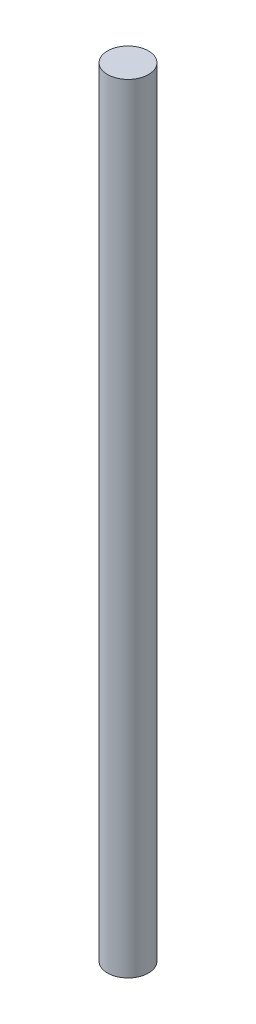
ISO-10303-21;
HEADER;
FILE_DESCRIPTION(('STEP AP214'),'2;1');
FILE_NAME('part.step','',(''),(''),'','','');
FILE_SCHEMA(('AUTOMOTIVE_DESIGN { 1 0 10303 214 1 1 1 1 }'));
ENDSEC;
DATA;
#1=APPLICATION_CONTEXT('core data for automotive mechanical design processes');
#2=APPLICATION_PROTOCOL_DEFINITION('international standard','automotive_design',2000,#1);
#3=PRODUCT_CONTEXT('',#1,'mechanical');
#4=PRODUCT('Part','Part','',(#3));
#5=PRODUCT_RELATED_PRODUCT_CATEGORY('part','',(#4));
#6=PRODUCT_DEFINITION_FORMATION('','',#4);
#7=PRODUCT_DEFINITION_CONTEXT('part definition',#1,'design');
#8=PRODUCT_DEFINITION('design','',#6,#7);
#9=PRODUCT_DEFINITION_SHAPE('','',#8);
#10=(LENGTH_UNIT() NAMED_UNIT(*) SI_UNIT(.MILLI.,.METRE.));
#11=(NAMED_UNIT(*) PLANE_ANGLE_UNIT() SI_UNIT($,.RADIAN.));
#12=(NAMED_UNIT(*) SI_UNIT($,.STERADIAN.) SOLID_ANGLE_UNIT());
#13=UNCERTAINTY_MEASURE_WITH_UNIT(LENGTH_MEASURE(1.E-05),#10,'distance_accuracy_value','');
#14=(GEOMETRIC_REPRESENTATION_CONTEXT(3) GLOBAL_UNCERTAINTY_ASSIGNED_CONTEXT((#13)) GLOBAL_UNIT_ASSIGNED_CONTEXT((#10,
#11,#12)) REPRESENTATION_CONTEXT('',''));
#15=CARTESIAN_POINT('',(0.,0.,0.));
#16=DIRECTION('',(0.,0.,1.));
#17=DIRECTION('',(1.,0.,0.));
#18=AXIS2_PLACEMENT_3D('',#15,#16,#17);
#19=CARTESIAN_POINT('',(0.,120.65,0.));
#20=DIRECTION('',(0.,-1.,0.));
#21=DIRECTION('',(0.,0.,-1.));
#22=AXIS2_PLACEMENT_3D('',#19,#20,#21);
#23=CYLINDRICAL_SURFACE('',#22,3.175);
#24=CARTESIAN_POINT('',(0.,120.65,0.));
#25=DIRECTION('',(0.,1.,0.));
#26=DIRECTION('',(0.,0.,1.));
#27=AXIS2_PLACEMENT_3D('',#24,#25,#26);
#28=CIRCLE('',#27,3.175);
#29=CARTESIAN_POINT('',(0.,120.65,-3.175));
#30=VERTEX_POINT('',#29);
#31=EDGE_CURVE('E10',#30,#30,#28,.T.);
#32=CARTESIAN_POINT('',(0.,0.,0.));
#33=DIRECTION('',(0.,1.,0.));
#34=DIRECTION('',(0.,0.,1.));
#35=AXIS2_PLACEMENT_3D('',#32,#33,#34);
#36=CIRCLE('',#35,3.175);
#37=CARTESIAN_POINT('',(0.,0.,-3.175));
#38=VERTEX_POINT('',#37);
#39=EDGE_CURVE('E44',#38,#38,#36,.T.);
#40=CARTESIAN_POINT('',(0.,120.65,-3.175));
#41=CARTESIAN_POINT('',(0.,119.393229166667,-3.175));
#42=CARTESIAN_POINT('',(0.,118.136458333333,-3.175));
#43=CARTESIAN_POINT('',(0.,115.622916666667,-3.175));
#44=CARTESIAN_POINT('',(0.,114.366145833333,-3.175));
#45=CARTESIAN_POINT('',(0.,111.852604166667,-3.175));
#46=CARTESIAN_POINT('',(0.,110.595833333333,-3.175));
#47=CARTESIAN_POINT('',(0.,108.082291666667,-3.175));
#48=CARTESIAN_POINT('',(0.,106.825520833333,-3.175));
#49=CARTESIAN_POINT('',(0.,104.311979166667,-3.175));
#50=CARTESIAN_POINT('',(0.,103.055208333333,-3.175));
#51=CARTESIAN_POINT('',(0.,100.541666666667,-3.175));
#52=CARTESIAN_POINT('',(0.,99.2848958333333,-3.175));
#53=CARTESIAN_POINT('',(0.,96.7713541666667,-3.175));
#54=CARTESIAN_POINT('',(0.,95.5145833333333,-3.175));
#55=CARTESIAN_POINT('',(0.,93.0010416666667,-3.175));
#56=CARTESIAN_POINT('',(0.,91.7442708333333,-3.175));
#57=CARTESIAN_POINT('',(0.,89.2307291666667,-3.175));
#58=CARTESIAN_POINT('',(0.,87.9739583333333,-3.175));
#59=CARTESIAN_POINT('',(0.,85.4604166666667,-3.175));
#60=CARTESIAN_POINT('',(0.,84.2036458333333,-3.175));
#61=CARTESIAN_POINT('',(0.,81.6901041666667,-3.175));
#62=CARTESIAN_POINT('',(0.,80.4333333333333,-3.175));
#63=CARTESIAN_POINT('',(0.,77.9197916666667,-3.175));
#64=CARTESIAN_POINT('',(0.,76.6630208333333,-3.175));
#65=CARTESIAN_POINT('',(0.,74.1494791666667,-3.175));
#66=CARTESIAN_POINT('',(0.,72.8927083333333,-3.175));
#67=CARTESIAN_POINT('',(0.,70.3791666666667,-3.175));
#68=CARTESIAN_POINT('',(0.,69.1223958333333,-3.175));
#69=CARTESIAN_POINT('',(0.,66.6088541666667,-3.175));
#70=CARTESIAN_POINT('',(0.,65.3520833333333,-3.175));
#71=CARTESIAN_POINT('',(0.,62.8385416666667,-3.175));
#72=CARTESIAN_POINT('',(0.,61.5817708333333,-3.175));
#73=CARTESIAN_POINT('',(0.,59.0682291666667,-3.175));
#74=CARTESIAN_POINT('',(0.,57.8114583333333,-3.175));
#75=CARTESIAN_POINT('',(0.,55.2979166666667,-3.175));
#76=CARTESIAN_POINT('',(0.,54.0411458333333,-3.175));
#77=CARTESIAN_POINT('',(0.,51.5276041666667,-3.175));
#78=CARTESIAN_POINT('',(0.,50.2708333333333,-3.175));
#79=CARTESIAN_POINT('',(0.,47.7572916666667,-3.175));
#80=CARTESIAN_POINT('',(0.,46.5005208333333,-3.175));
#81=CARTESIAN_POINT('',(0.,43.9869791666667,-3.175));
#82=CARTESIAN_POINT('',(0.,42.7302083333333,-3.175));
#83=CARTESIAN_POINT('',(0.,40.2166666666667,-3.175));
#84=CARTESIAN_POINT('',(0.,38.9598958333333,-3.175));
#85=CARTESIAN_POINT('',(0.,36.4463541666667,-3.175));
#86=CARTESIAN_POINT('',(0.,35.1895833333333,-3.175));
#87=CARTESIAN_POINT('',(0.,32.6760416666667,-3.175));
#88=CARTESIAN_POINT('',(0.,31.4192708333333,-3.175));
#89=CARTESIAN_POINT('',(0.,28.9057291666667,-3.175));
#90=CARTESIAN_POINT('',(0.,27.6489583333333,-3.175));
#91=CARTESIAN_POINT('',(0.,25.1354166666667,-3.175));
#92=CARTESIAN_POINT('',(0.,23.8786458333333,-3.175));
#93=CARTESIAN_POINT('',(0.,21.3651041666667,-3.175));
#94=CARTESIAN_POINT('',(0.,20.1083333333333,-3.175));
#95=CARTESIAN_POINT('',(0.,17.5947916666667,-3.175));
#96=CARTESIAN_POINT('',(0.,16.3380208333333,-3.175));
#97=CARTESIAN_POINT('',(0.,13.8244791666667,-3.175));
#98=CARTESIAN_POINT('',(0.,12.5677083333333,-3.175));
#99=CARTESIAN_POINT('',(0.,10.0541666666667,-3.175));
#100=CARTESIAN_POINT('',(0.,8.79739583333333,-3.175));
#101=CARTESIAN_POINT('',(0.,6.28385416666666,-3.175));
#102=CARTESIAN_POINT('',(0.,5.02708333333333,-3.175));
#103=CARTESIAN_POINT('',(0.,2.51354166666667,-3.175));
#104=CARTESIAN_POINT('',(0.,1.25677083333333,-3.175));
#105=CARTESIAN_POINT('',(0.,0.,-3.175));
#106=B_SPLINE_CURVE_WITH_KNOTS('',3,(#40,#41,#42,#43,#44,#45,#46,#47,#48,#49,#50,#51,#52,#53,
#54,#55,#56,#57,#58,#59,#60,#61,#62,#63,#64,#65,#66,#67,#68,#69,#70,#71,#72,#73,#74,#75,#76,#77,
#78,#79,#80,#81,#82,#83,#84,#85,#86,#87,#88,#89,#90,#91,#92,#93,#94,#95,#96,#97,#98,#99,#100,
#101,#102,#103,#104,#105),.UNSPECIFIED.,.F.,.F.,(4,2,2,2,2,2,2,2,2,2,2,2,2,2,2,2,2,2,2,2,2,2,2,
2,2,2,2,2,2,2,2,2,4),(0.,3.7703125,7.540625,11.3109375,15.08125,18.8515625,22.621875,26.3921875,
30.1625,33.9328125,37.703125,41.4734375,45.24375,49.0140625,52.784375,56.5546875,60.325,
64.0953125,67.865625,71.6359375,75.40625,79.1765625,82.946875,86.7171875,90.4875,94.2578125,
98.028125,101.7984375,105.56875,109.3390625,113.109375,116.8796875,120.65),.UNSPECIFIED.);
#107=EDGE_CURVE('BSEAM41',#30,#38,#106,.T.);
#108=ORIENTED_EDGE('',*,*,#31,.F.);
#109=ORIENTED_EDGE('',*,*,#39,.T.);
#110=ORIENTED_EDGE('',*,*,#107,.T.);
#111=ORIENTED_EDGE('',*,*,#107,.F.);
#112=EDGE_LOOP('',(#108,#110,#109,#111));
#113=FACE_BOUND('',#112,.T.);
#114=ADVANCED_FACE('F41',(#113),#23,.T.);
#115=CARTESIAN_POINT('',(0.,120.65,0.));
#116=DIRECTION('',(0.,1.,0.));
#117=DIRECTION('',(0.,0.,1.));
#118=AXIS2_PLACEMENT_3D('',#115,#116,#117);
#119=PLANE('',#118);
#120=ORIENTED_EDGE('',*,*,#31,.T.);
#121=EDGE_LOOP('',(#120));
#122=FACE_BOUND('',#121,.T.);
#123=ADVANCED_FACE('F58',(#122),#119,.T.);
#124=CARTESIAN_POINT('',(0.,0.,0.));
#125=DIRECTION('',(0.,1.,0.));
#126=DIRECTION('',(0.,0.,1.));
#127=AXIS2_PLACEMENT_3D('',#124,#125,#126);
#128=PLANE('',#127);
#129=ORIENTED_EDGE('',*,*,#39,.F.);
#130=EDGE_LOOP('',(#129));
#131=FACE_BOUND('',#130,.T.);
#132=ADVANCED_FACE('F56',(#131),#128,.F.);
#133=CLOSED_SHELL('',(#114,#123,#132));
#134=MANIFOLD_SOLID_BREP('B2',#133);
#135=ADVANCED_BREP_SHAPE_REPRESENTATION('',(#18,#134),#14);
#136=SHAPE_DEFINITION_REPRESENTATION(#9,#135);
ENDSEC;
END-ISO-10303-21;
